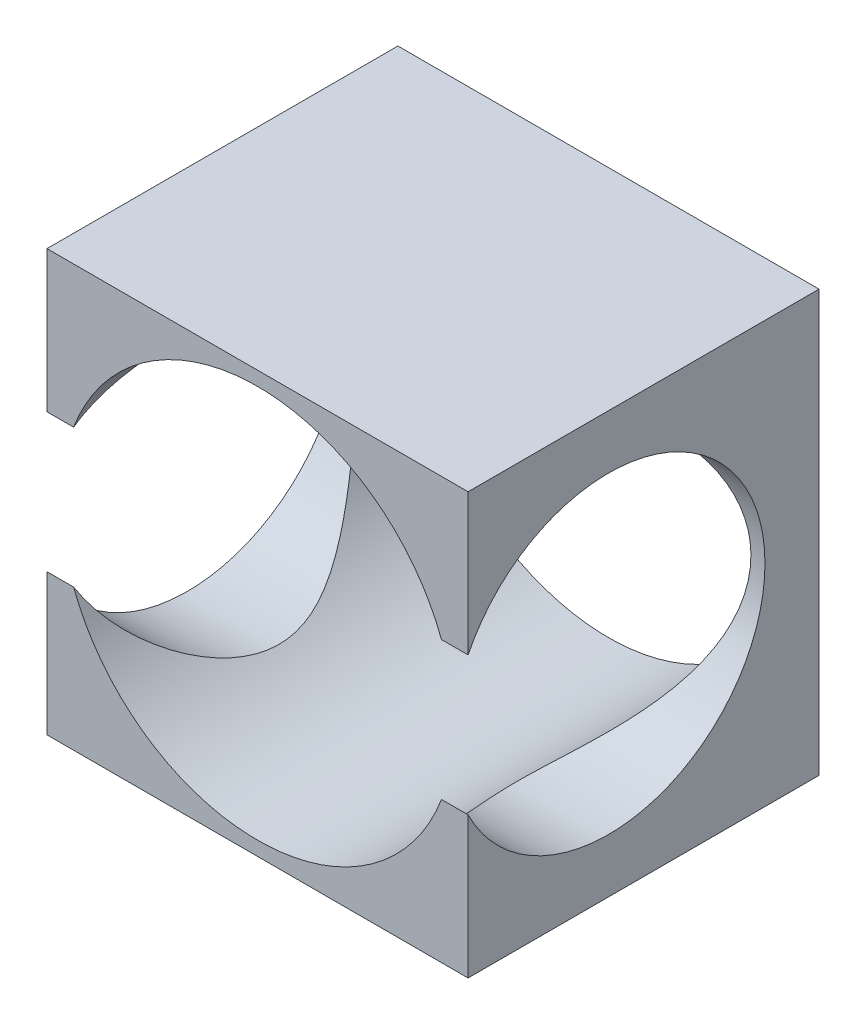
ISO-10303-21;
HEADER;
FILE_DESCRIPTION(('STEP AP214'),'2;1');
FILE_NAME('part.step','',(''),(''),'','','');
FILE_SCHEMA(('AUTOMOTIVE_DESIGN { 1 0 10303 214 1 1 1 1 }'));
ENDSEC;
DATA;
#1=APPLICATION_CONTEXT('core data for automotive mechanical design processes');
#2=APPLICATION_PROTOCOL_DEFINITION('international standard','automotive_design',2000,#1);
#3=PRODUCT_CONTEXT('',#1,'mechanical');
#4=PRODUCT('Part','Part','',(#3));
#5=PRODUCT_RELATED_PRODUCT_CATEGORY('part','',(#4));
#6=PRODUCT_DEFINITION_FORMATION('','',#4);
#7=PRODUCT_DEFINITION_CONTEXT('part definition',#1,'design');
#8=PRODUCT_DEFINITION('design','',#6,#7);
#9=PRODUCT_DEFINITION_SHAPE('','',#8);
#10=(LENGTH_UNIT() NAMED_UNIT(*) SI_UNIT(.MILLI.,.METRE.));
#11=(NAMED_UNIT(*) PLANE_ANGLE_UNIT() SI_UNIT($,.RADIAN.));
#12=(NAMED_UNIT(*) SI_UNIT($,.STERADIAN.) SOLID_ANGLE_UNIT());
#13=UNCERTAINTY_MEASURE_WITH_UNIT(LENGTH_MEASURE(1.E-05),#10,'distance_accuracy_value','');
#14=(GEOMETRIC_REPRESENTATION_CONTEXT(3) GLOBAL_UNCERTAINTY_ASSIGNED_CONTEXT((#13)) GLOBAL_UNIT_ASSIGNED_CONTEXT((#10,
#11,#12)) REPRESENTATION_CONTEXT('',''));
#15=CARTESIAN_POINT('',(0.,0.,0.));
#16=DIRECTION('',(0.,0.,1.));
#17=DIRECTION('',(1.,0.,0.));
#18=AXIS2_PLACEMENT_3D('',#15,#16,#17);
#19=CARTESIAN_POINT('',(0.,0.,25.));
#20=DIRECTION('',(0.,0.,-1.));
#21=DIRECTION('',(-1.,0.,0.));
#22=AXIS2_PLACEMENT_3D('',#19,#20,#21);
#23=PLANE('',#22);
#24=DIRECTION('',(0.,1.,0.));
#25=VECTOR('',#24,1.);
#26=CARTESIAN_POINT('',(15.,15.,25.));
#27=LINE('',#26,#25);
#28=CARTESIAN_POINT('',(15.,-15.,25.));
#29=VERTEX_POINT('',#28);
#30=CARTESIAN_POINT('',(15.,-4.93178466683207,25.));
#31=VERTEX_POINT('',#30);
#32=EDGE_CURVE('E124',#29,#31,#27,.T.);
#33=ORIENTED_EDGE('',*,*,#32,.T.);
#34=DIRECTION('',(-1.,0.,0.));
#35=VECTOR('',#34,1.);
#36=CARTESIAN_POINT('',(15.,-4.93178466683207,25.));
#37=LINE('',#36,#35);
#38=CARTESIAN_POINT('',(13.1025760825877,-4.93178466683207,25.));
#39=VERTEX_POINT('',#38);
#40=EDGE_CURVE('E108',#31,#39,#37,.T.);
#41=ORIENTED_EDGE('',*,*,#40,.T.);
#42=CARTESIAN_POINT('',(0.,0.,25.));
#43=DIRECTION('',(0.,0.,1.));
#44=DIRECTION('',(1.,0.,0.));
#45=AXIS2_PLACEMENT_3D('',#42,#43,#44);
#46=CIRCLE('',#45,14.);
#47=CARTESIAN_POINT('',(-13.1025760825877,-4.93178466683208,25.));
#48=VERTEX_POINT('',#47);
#49=EDGE_CURVE('E263',#48,#39,#46,.T.);
#50=ORIENTED_EDGE('',*,*,#49,.F.);
#51=CARTESIAN_POINT('',(-15.,-4.93178466683208,25.));
#52=VERTEX_POINT('',#51);
#53=EDGE_CURVE('E60',#48,#52,#37,.T.);
#54=ORIENTED_EDGE('',*,*,#53,.T.);
#55=DIRECTION('',(0.,-1.,0.));
#56=VECTOR('',#55,1.);
#57=CARTESIAN_POINT('',(-15.,15.,25.));
#58=LINE('',#57,#56);
#59=CARTESIAN_POINT('',(-15.,-15.,25.));
#60=VERTEX_POINT('',#59);
#61=EDGE_CURVE('E157',#52,#60,#58,.T.);
#62=ORIENTED_EDGE('',*,*,#61,.T.);
#63=DIRECTION('',(1.,0.,0.));
#64=VECTOR('',#63,1.);
#65=CARTESIAN_POINT('',(15.,-15.,25.));
#66=LINE('',#65,#64);
#67=EDGE_CURVE('E131',#60,#29,#66,.T.);
#68=ORIENTED_EDGE('',*,*,#67,.T.);
#69=EDGE_LOOP('',(#33,#41,#50,#54,#62,#68));
#70=FACE_BOUND('',#69,.T.);
#71=ADVANCED_FACE('F39',(#70),#23,.F.);
#72=CARTESIAN_POINT('',(-15.,15.,25.));
#73=VERTEX_POINT('',#72);
#74=CARTESIAN_POINT('',(-15.,4.93178466683207,25.));
#75=VERTEX_POINT('',#74);
#76=EDGE_CURVE('E253',#73,#75,#58,.T.);
#77=ORIENTED_EDGE('',*,*,#76,.T.);
#78=DIRECTION('',(-1.,0.,0.));
#79=VECTOR('',#78,1.);
#80=CARTESIAN_POINT('',(15.,4.93178466683208,25.));
#81=LINE('',#80,#79);
#82=CARTESIAN_POINT('',(-13.1025760825877,4.93178466683207,25.));
#83=VERTEX_POINT('',#82);
#84=EDGE_CURVE('E117',#75,#83,#81,.F.);
#85=ORIENTED_EDGE('',*,*,#84,.T.);
#86=CARTESIAN_POINT('',(13.1025760825877,4.93178466683208,25.));
#87=VERTEX_POINT('',#86);
#88=EDGE_CURVE('E148',#87,#83,#46,.T.);
#89=ORIENTED_EDGE('',*,*,#88,.F.);
#90=CARTESIAN_POINT('',(15.,4.93178466683208,25.));
#91=VERTEX_POINT('',#90);
#92=EDGE_CURVE('E68',#87,#91,#81,.F.);
#93=ORIENTED_EDGE('',*,*,#92,.T.);
#94=CARTESIAN_POINT('',(15.,15.,25.));
#95=VERTEX_POINT('',#94);
#96=EDGE_CURVE('E126',#91,#95,#27,.T.);
#97=ORIENTED_EDGE('',*,*,#96,.T.);
#98=DIRECTION('',(-1.,0.,0.));
#99=VECTOR('',#98,1.);
#100=CARTESIAN_POINT('',(15.,15.,25.));
#101=LINE('',#100,#99);
#102=EDGE_CURVE('E134',#95,#73,#101,.T.);
#103=ORIENTED_EDGE('',*,*,#102,.T.);
#104=EDGE_LOOP('',(#77,#85,#89,#93,#97,#103));
#105=FACE_BOUND('',#104,.T.);
#106=ADVANCED_FACE('F219',(#105),#23,.F.);
#107=CARTESIAN_POINT('',(0.,0.,0.));
#108=DIRECTION('',(0.,0.,-1.));
#109=DIRECTION('',(-1.,0.,0.));
#110=AXIS2_PLACEMENT_3D('',#107,#108,#109);
#111=PLANE('',#110);
#112=CARTESIAN_POINT('',(12.,11.9999999999993,0.));
#113=DIRECTION('',(0.,0.,-1.));
#114=DIRECTION('',(-1.,0.,0.));
#115=AXIS2_PLACEMENT_3D('',#112,#113,#114);
#116=CIRCLE('',#115,1.36336852858037);
#117=CARTESIAN_POINT('',(10.6366314714196,11.9999999999993,0.));
#118=VERTEX_POINT('',#117);
#119=EDGE_CURVE('E280',#118,#118,#116,.T.);
#120=ORIENTED_EDGE('',*,*,#119,.F.);
#121=EDGE_LOOP('',(#120));
#122=FACE_BOUND('',#121,.T.);
#123=CARTESIAN_POINT('',(11.9999999999993,-12.0000000000007,0.));
#124=DIRECTION('',(0.,0.,-1.));
#125=DIRECTION('',(-1.,0.,0.));
#126=AXIS2_PLACEMENT_3D('',#123,#124,#125);
#127=CIRCLE('',#126,1.36336852858015);
#128=CARTESIAN_POINT('',(10.6366314714192,-12.0000000000007,0.));
#129=VERTEX_POINT('',#128);
#130=EDGE_CURVE('E288',#129,#129,#127,.T.);
#131=ORIENTED_EDGE('',*,*,#130,.F.);
#132=EDGE_LOOP('',(#131));
#133=FACE_BOUND('',#132,.T.);
#134=CARTESIAN_POINT('',(-12.0000000000007,-12.,0.));
#135=DIRECTION('',(0.,0.,-1.));
#136=DIRECTION('',(-1.,0.,0.));
#137=AXIS2_PLACEMENT_3D('',#134,#135,#136);
#138=CIRCLE('',#137,1.36336852857949);
#139=CARTESIAN_POINT('',(-13.3633685285801,-12.,0.));
#140=VERTEX_POINT('',#139);
#141=EDGE_CURVE('E296',#140,#140,#138,.T.);
#142=ORIENTED_EDGE('',*,*,#141,.F.);
#143=EDGE_LOOP('',(#142));
#144=FACE_BOUND('',#143,.T.);
#145=CARTESIAN_POINT('',(-12.,12.,0.));
#146=DIRECTION('',(0.,0.,-1.));
#147=DIRECTION('',(-1.,0.,0.));
#148=AXIS2_PLACEMENT_3D('',#145,#146,#147);
#149=CIRCLE('',#148,1.36336852857966);
#150=CARTESIAN_POINT('',(-13.3633685285797,12.,0.));
#151=VERTEX_POINT('',#150);
#152=EDGE_CURVE('E272',#151,#151,#149,.T.);
#153=ORIENTED_EDGE('',*,*,#152,.F.);
#154=EDGE_LOOP('',(#153));
#155=FACE_BOUND('',#154,.T.);
#156=DIRECTION('',(0.,-1.,0.));
#157=VECTOR('',#156,1.);
#158=CARTESIAN_POINT('',(-15.,15.,0.));
#159=LINE('',#158,#157);
#160=CARTESIAN_POINT('',(-15.,15.,0.));
#161=VERTEX_POINT('',#160);
#162=CARTESIAN_POINT('',(-15.,-15.,0.));
#163=VERTEX_POINT('',#162);
#164=EDGE_CURVE('E143',#161,#163,#159,.T.);
#165=ORIENTED_EDGE('',*,*,#164,.F.);
#166=DIRECTION('',(-1.,0.,0.));
#167=VECTOR('',#166,1.);
#168=CARTESIAN_POINT('',(15.,15.,0.));
#169=LINE('',#168,#167);
#170=CARTESIAN_POINT('',(15.,15.,0.));
#171=VERTEX_POINT('',#170);
#172=EDGE_CURVE('E154',#171,#161,#169,.T.);
#173=ORIENTED_EDGE('',*,*,#172,.F.);
#174=DIRECTION('',(0.,1.,0.));
#175=VECTOR('',#174,1.);
#176=CARTESIAN_POINT('',(15.,15.,0.));
#177=LINE('',#176,#175);
#178=CARTESIAN_POINT('',(15.,-15.,0.));
#179=VERTEX_POINT('',#178);
#180=EDGE_CURVE('E151',#179,#171,#177,.T.);
#181=ORIENTED_EDGE('',*,*,#180,.F.);
#182=DIRECTION('',(1.,0.,0.));
#183=VECTOR('',#182,1.);
#184=CARTESIAN_POINT('',(15.,-15.,0.));
#185=LINE('',#184,#183);
#186=EDGE_CURVE('E147',#163,#179,#185,.T.);
#187=ORIENTED_EDGE('',*,*,#186,.F.);
#188=EDGE_LOOP('',(#165,#173,#181,#187));
#189=FACE_BOUND('',#188,.T.);
#190=CARTESIAN_POINT('',(0.,0.,0.));
#191=DIRECTION('',(0.,0.,1.));
#192=DIRECTION('',(1.,0.,0.));
#193=AXIS2_PLACEMENT_3D('',#190,#191,#192);
#194=CIRCLE('',#193,14.);
#195=CARTESIAN_POINT('',(14.,0.,0.));
#196=VERTEX_POINT('',#195);
#197=EDGE_CURVE('E259',#196,#196,#194,.T.);
#198=ORIENTED_EDGE('',*,*,#197,.T.);
#199=EDGE_LOOP('',(#198));
#200=FACE_BOUND('',#199,.T.);
#201=ADVANCED_FACE('F223',(#122,#133,#144,#155,#189,#200),#111,.T.);
#202=CARTESIAN_POINT('',(-15.,15.,25.));
#203=DIRECTION('',(1.,0.,0.));
#204=DIRECTION('',(0.,1.,0.));
#205=AXIS2_PLACEMENT_3D('',#202,#203,#204);
#206=PLANE('',#205);
#207=ORIENTED_EDGE('',*,*,#61,.F.);
#208=CARTESIAN_POINT('',(-15.,0.,15.));
#209=DIRECTION('',(-1.,0.,0.));
#210=DIRECTION('',(0.,-1.,0.));
#211=AXIS2_PLACEMENT_3D('',#208,#209,#210);
#212=CIRCLE('',#211,11.15);
#213=EDGE_CURVE('E128',#75,#52,#212,.T.);
#214=ORIENTED_EDGE('',*,*,#213,.F.);
#215=ORIENTED_EDGE('',*,*,#76,.F.);
#216=DIRECTION('',(0.,0.,-1.));
#217=VECTOR('',#216,1.);
#218=CARTESIAN_POINT('',(-15.,15.,25.));
#219=LINE('',#218,#217);
#220=EDGE_CURVE('E138',#73,#161,#219,.T.);
#221=ORIENTED_EDGE('',*,*,#220,.T.);
#222=ORIENTED_EDGE('',*,*,#164,.T.);
#223=DIRECTION('',(0.,0.,-1.));
#224=VECTOR('',#223,1.);
#225=CARTESIAN_POINT('',(-15.,-15.,25.));
#226=LINE('',#225,#224);
#227=EDGE_CURVE('E168',#60,#163,#226,.T.);
#228=ORIENTED_EDGE('',*,*,#227,.F.);
#229=EDGE_LOOP('',(#207,#214,#215,#221,#222,#228));
#230=FACE_BOUND('',#229,.T.);
#231=ADVANCED_FACE('F41',(#230),#206,.F.);
#232=CARTESIAN_POINT('',(15.,-15.,25.));
#233=DIRECTION('',(0.,1.,0.));
#234=DIRECTION('',(-1.,0.,0.));
#235=AXIS2_PLACEMENT_3D('',#232,#233,#234);
#236=PLANE('',#235);
#237=ORIENTED_EDGE('',*,*,#186,.T.);
#238=DIRECTION('',(0.,0.,-1.));
#239=VECTOR('',#238,1.);
#240=CARTESIAN_POINT('',(15.,-15.,25.));
#241=LINE('',#240,#239);
#242=EDGE_CURVE('E165',#29,#179,#241,.T.);
#243=ORIENTED_EDGE('',*,*,#242,.F.);
#244=ORIENTED_EDGE('',*,*,#67,.F.);
#245=ORIENTED_EDGE('',*,*,#227,.T.);
#246=EDGE_LOOP('',(#237,#243,#244,#245));
#247=FACE_BOUND('',#246,.T.);
#248=ADVANCED_FACE('F234',(#247),#236,.F.);
#249=CARTESIAN_POINT('',(15.,15.,25.));
#250=DIRECTION('',(-1.,0.,0.));
#251=DIRECTION('',(0.,-1.,0.));
#252=AXIS2_PLACEMENT_3D('',#249,#250,#251);
#253=PLANE('',#252);
#254=ORIENTED_EDGE('',*,*,#96,.F.);
#255=CARTESIAN_POINT('',(15.,0.,15.));
#256=DIRECTION('',(-1.,0.,0.));
#257=DIRECTION('',(0.,-1.,0.));
#258=AXIS2_PLACEMENT_3D('',#255,#256,#257);
#259=CIRCLE('',#258,11.15);
#260=EDGE_CURVE('E111',#91,#31,#259,.T.);
#261=ORIENTED_EDGE('',*,*,#260,.T.);
#262=ORIENTED_EDGE('',*,*,#32,.F.);
#263=ORIENTED_EDGE('',*,*,#242,.T.);
#264=ORIENTED_EDGE('',*,*,#180,.T.);
#265=DIRECTION('',(0.,0.,-1.));
#266=VECTOR('',#265,1.);
#267=CARTESIAN_POINT('',(15.,15.,25.));
#268=LINE('',#267,#266);
#269=EDGE_CURVE('E161',#95,#171,#268,.T.);
#270=ORIENTED_EDGE('',*,*,#269,.F.);
#271=EDGE_LOOP('',(#254,#261,#262,#263,#264,#270));
#272=FACE_BOUND('',#271,.T.);
#273=ADVANCED_FACE('F122',(#272),#253,.F.);
#274=CARTESIAN_POINT('',(15.,15.,25.));
#275=DIRECTION('',(0.,-1.,0.));
#276=DIRECTION('',(1.,0.,0.));
#277=AXIS2_PLACEMENT_3D('',#274,#275,#276);
#278=PLANE('',#277);
#279=ORIENTED_EDGE('',*,*,#172,.T.);
#280=ORIENTED_EDGE('',*,*,#220,.F.);
#281=ORIENTED_EDGE('',*,*,#102,.F.);
#282=ORIENTED_EDGE('',*,*,#269,.T.);
#283=EDGE_LOOP('',(#279,#280,#281,#282));
#284=FACE_BOUND('',#283,.T.);
#285=ADVANCED_FACE('F229',(#284),#278,.F.);
#286=CARTESIAN_POINT('',(0.,0.,25.));
#287=DIRECTION('',(0.,0.,-1.));
#288=DIRECTION('',(-1.,0.,0.));
#289=AXIS2_PLACEMENT_3D('',#286,#287,#288);
#290=CYLINDRICAL_SURFACE('',#289,14.);
#291=CARTESIAN_POINT('',(-13.1025760825877,-4.93178466683208,25.));
#292=CARTESIAN_POINT('',(-12.9887783529517,-5.23421419488892,24.8508376342914));
#293=CARTESIAN_POINT('',(-12.8665483815956,-5.52710747355063,24.6893468760296));
#294=CARTESIAN_POINT('',(-12.6085752131752,-6.09262052423046,24.3440953083494));
#295=CARTESIAN_POINT('',(-12.4728490390368,-6.36526509621003,24.1603624910479));
#296=CARTESIAN_POINT('',(-12.1911586341299,-6.88942182592347,23.7729382298264));
#297=CARTESIAN_POINT('',(-12.0452109649413,-7.14096678083283,23.5692788689796));
#298=CARTESIAN_POINT('',(-11.7459811365691,-7.62315115394514,23.1433158317503));
#299=CARTESIAN_POINT('',(-11.5926966700582,-7.85378392865791,22.9210062733576));
#300=CARTESIAN_POINT('',(-11.2828101891928,-8.29276950110354,22.4601124961406));
#301=CARTESIAN_POINT('',(-11.1262281190263,-8.50122596580811,22.2216133908344));
#302=CARTESIAN_POINT('',(-10.8123907581524,-8.89696364600976,21.7280460398588));
#303=CARTESIAN_POINT('',(-10.6551354415557,-9.08424403946544,21.4729771515659));
#304=CARTESIAN_POINT('',(-10.3436915762659,-9.4373450899898,20.9463922432151));
#305=CARTESIAN_POINT('',(-10.1895045579359,-9.60315525476708,20.6748682761568));
#306=CARTESIAN_POINT('',(-9.88883367959778,-9.91248805338215,20.1153896590899));
#307=CARTESIAN_POINT('',(-9.74234702307798,-10.0560188158495,19.8274410542854));
#308=CARTESIAN_POINT('',(-9.50790990391392,-10.2769941458775,19.3305932828693));
#309=CARTESIAN_POINT('',(-9.41634031055152,-10.3608062560434,19.1262181034476));
#310=CARTESIAN_POINT('',(-9.24140642669867,-10.5171363315957,18.7096936691483));
#311=CARTESIAN_POINT('',(-9.15804310167615,-10.5896529686522,18.4975435035627));
#312=CARTESIAN_POINT('',(-9.00213011883525,-10.7225057350015,18.0661362320965));
#313=CARTESIAN_POINT('',(-8.92955649904224,-10.7828689637938,17.8468962319737));
#314=CARTESIAN_POINT('',(-8.79767020469302,-10.8907424886888,17.4013955512337));
#315=CARTESIAN_POINT('',(-8.7383524053564,-10.9382577533892,17.1751376224503));
#316=CARTESIAN_POINT('',(-8.64457892338949,-11.012455838992,16.7565047881617));
#317=CARTESIAN_POINT('',(-8.60759309422161,-11.0413249776939,16.5650848886693));
#318=CARTESIAN_POINT('',(-8.54585249359701,-11.0891812183278,16.1791263884067));
#319=CARTESIAN_POINT('',(-8.52109177293486,-11.1081731271385,15.9845893522366));
#320=CARTESIAN_POINT('',(-8.48481623568604,-11.1359068222375,15.5936714717287));
#321=CARTESIAN_POINT('',(-8.47329280069976,-11.1446552778026,15.3972919110771));
#322=CARTESIAN_POINT('',(-8.46397511982196,-11.1517335649993,15.0040116779049));
#323=CARTESIAN_POINT('',(-8.46618106628972,-11.1500632506558,14.8071109981217));
#324=CARTESIAN_POINT('',(-8.48421552493971,-11.1363464064946,14.4144645598795));
#325=CARTESIAN_POINT('',(-8.50003318335374,-11.1243081439117,14.2187180063187));
#326=CARTESIAN_POINT('',(-8.54458509730658,-11.0901238246574,13.8296128838672));
#327=CARTESIAN_POINT('',(-8.57331945819693,-11.0679776855438,13.6362543344669));
#328=CARTESIAN_POINT('',(-8.64260096631545,-11.0139625352675,13.2528107317564));
#329=CARTESIAN_POINT('',(-8.68316307064017,-10.9820812107859,13.0627301480403));
#330=CARTESIAN_POINT('',(-8.7746698728894,-10.9091058041691,12.6868662134602));
#331=CARTESIAN_POINT('',(-8.82561773093081,-10.8680089175946,12.5010841897411));
#332=CARTESIAN_POINT('',(-8.96339277406247,-10.7549490886205,12.0449109686328));
#333=CARTESIAN_POINT('',(-9.05560068232055,-10.6777074585978,11.7774416501676));
#334=CARTESIAN_POINT('',(-9.25481538569384,-10.5055090915351,11.2539618860941));
#335=CARTESIAN_POINT('',(-9.36182959272556,-10.4105434736462,10.9979572651174));
#336=CARTESIAN_POINT('',(-9.58673223394592,-10.2038205683363,10.4968680946616));
#337=CARTESIAN_POINT('',(-9.70464984716077,-10.0920176888186,10.2518156123556));
#338=CARTESIAN_POINT('',(-9.94755510736531,-9.85267685486661,9.77325784345241));
#339=CARTESIAN_POINT('',(-10.0725423987605,-9.72513969146333,9.53975197718269));
#340=CARTESIAN_POINT('',(-10.3663770817765,-9.41262150102573,9.01284796500428));
#341=CARTESIAN_POINT('',(-10.5367262592172,-9.22214322625381,8.72353353679664));
#342=CARTESIAN_POINT('',(-10.8790927992864,-8.81566967195463,8.16436114551135));
#343=CARTESIAN_POINT('',(-11.0511106807575,-8.59966620629997,7.89450946921473));
#344=CARTESIAN_POINT('',(-11.3919484625575,-8.14276779698837,7.37521884859543));
#345=CARTESIAN_POINT('',(-11.5607717394422,-7.90190109836265,7.1257573058782));
#346=CARTESIAN_POINT('',(-11.8911738795332,-7.39536162115058,6.64822182226211));
#347=CARTESIAN_POINT('',(-12.0527551906455,-7.12969731961019,6.42014062555605));
#348=CARTESIAN_POINT('',(-12.3318235707118,-6.63245372193324,6.0328168523127));
#349=CARTESIAN_POINT('',(-12.451433041623,-6.40547029905498,5.86918977180891));
#350=CARTESIAN_POINT('',(-12.6816533407883,-5.93665143531961,5.55765672360376));
#351=CARTESIAN_POINT('',(-12.7922659568958,-5.69481896210805,5.40974763062727));
#352=CARTESIAN_POINT('',(-13.0023965328125,-5.19716832794095,5.13120272714219));
#353=CARTESIAN_POINT('',(-13.1019264962962,-4.94136575476293,5.00054819901947));
#354=CARTESIAN_POINT('',(-13.2880340566548,-4.41651766120062,4.75790991341728));
#355=CARTESIAN_POINT('',(-13.3746135872451,-4.14747412590197,4.64592336821032));
#356=CARTESIAN_POINT('',(-13.52092994083,-3.63915552224572,4.45765689191971));
#357=CARTESIAN_POINT('',(-13.5827460176764,-3.40152779626527,4.37853837998416));
#358=CARTESIAN_POINT('',(-13.694565454543,-2.91893728613214,4.23591226650879));
#359=CARTESIAN_POINT('',(-13.7445709469678,-2.67397583509884,4.17240184683888));
#360=CARTESIAN_POINT('',(-13.8318035476458,-2.17819582050779,4.06188129692984));
#361=CARTESIAN_POINT('',(-13.8690348248015,-1.92737919639779,4.01486578341663));
#362=CARTESIAN_POINT('',(-13.9299776121543,-1.42148740738285,3.93802346551209));
#363=CARTESIAN_POINT('',(-13.9536889588702,-1.16641219102195,3.90819686896689));
#364=CARTESIAN_POINT('',(-13.9871273262331,-0.653144308339897,3.8661599528713));
#365=CARTESIAN_POINT('',(-13.9968134359403,-0.394944728419742,3.85400116911558));
#366=CARTESIAN_POINT('',(-14.0018544060871,0.121816421907694,3.84767151854596));
#367=CARTESIAN_POINT('',(-13.9972092401944,0.380377992979229,3.85350068478327));
#368=CARTESIAN_POINT('',(-13.9736909860817,0.895843205199144,3.88304811235112));
#369=CARTESIAN_POINT('',(-13.9548165985034,1.15274669277675,3.90676800739504));
#370=CARTESIAN_POINT('',(-13.9032529868709,1.66291645761688,3.97170308921471));
#371=CARTESIAN_POINT('',(-13.8705639556673,1.91618278560263,4.01291803176199));
#372=CARTESIAN_POINT('',(-13.7937897931493,2.40627652155016,4.11000560145911));
#373=CARTESIAN_POINT('',(-13.7502689443046,2.64333709514117,4.16515405165877));
#374=CARTESIAN_POINT('',(-13.6520060967279,3.11125434001027,4.29013250340905));
#375=CARTESIAN_POINT('',(-13.5972602215315,3.34210883683804,4.3599675770709));
#376=CARTESIAN_POINT('',(-13.4774931979169,3.79635929554347,4.5134550207985));
#377=CARTESIAN_POINT('',(-13.4124743244174,4.01975689548896,4.59710433193574));
#378=CARTESIAN_POINT('',(-13.2731378714007,4.45833851261599,4.77737995898847));
#379=CARTESIAN_POINT('',(-13.1988169090439,4.67351950436476,4.87401099684001));
#380=CARTESIAN_POINT('',(-13.0335777820955,5.11739683682902,5.09030628525269));
#381=CARTESIAN_POINT('',(-12.9417348701465,5.34508712080207,5.21132792145168));
#382=CARTESIAN_POINT('',(-12.7493912521699,5.78891658803717,5.46707893940776));
#383=CARTESIAN_POINT('',(-12.6488869550832,6.00505091937214,5.60181401106451));
#384=CARTESIAN_POINT('',(-12.4406763077636,6.42530769541241,5.88397024226262));
#385=CARTESIAN_POINT('',(-12.3329679880401,6.62942682639925,6.03139487415933));
#386=CARTESIAN_POINT('',(-12.1118109959154,7.02534451657401,6.33802885691184));
#387=CARTESIAN_POINT('',(-11.9983615620828,7.21714143379706,6.49723977225996));
#388=CARTESIAN_POINT('',(-11.7429398155155,7.62714032608053,6.8612456706812));
#389=CARTESIAN_POINT('',(-11.5999721832833,7.8424535932573,7.06860170939642));
#390=CARTESIAN_POINT('',(-11.3103549180673,8.25465521903203,7.49854087874509));
#391=CARTESIAN_POINT('',(-11.1637046220818,8.45154022933114,7.72112676387793));
#392=CARTESIAN_POINT('',(-10.8693693552137,8.82687552975064,8.18113054616772));
#393=CARTESIAN_POINT('',(-10.7216835246227,9.00530790177482,8.41856250702284));
#394=CARTESIAN_POINT('',(-10.4285221546076,9.34322881784751,8.90779554394506));
#395=CARTESIAN_POINT('',(-10.2830462553644,9.50272047527178,9.1595942483802));
#396=CARTESIAN_POINT('',(-10.0195422798362,9.77954797312595,9.63834401652563));
#397=CARTESIAN_POINT('',(-9.90069760178503,9.89960870648624,9.86327166747449));
#398=CARTESIAN_POINT('',(-9.66981988476173,10.1252469814304,10.3237188715833));
#399=CARTESIAN_POINT('',(-9.55778730838742,10.2308235400297,10.5592391421842));
#400=CARTESIAN_POINT('',(-9.34389254250157,10.4265358960743,11.0405524481337));
#401=CARTESIAN_POINT('',(-9.24201272843079,10.516698652766,11.2863265924139));
#402=CARTESIAN_POINT('',(-9.05195940879602,10.6807206108743,11.788399650489));
#403=CARTESIAN_POINT('',(-8.96378054812803,10.7545861869118,12.0446944024701));
#404=CARTESIAN_POINT('',(-8.82690143638443,10.8669863961809,12.4960976028834));
#405=CARTESIAN_POINT('',(-8.77398553479752,10.9096669137077,12.6888989472193));
#406=CARTESIAN_POINT('',(-8.679370506757,10.9850896023486,13.0791231325098));
#407=CARTESIAN_POINT('',(-8.63766792110378,11.017834838802,13.2765445277469));
#408=CARTESIAN_POINT('',(-8.56710643795466,11.0727907571872,13.6748064410875));
#409=CARTESIAN_POINT('',(-8.53822675539271,11.0950184911553,13.8756408740689));
#410=CARTESIAN_POINT('',(-8.49446455323188,11.1285596818921,14.279752613114));
#411=CARTESIAN_POINT('',(-8.47958179313935,11.1398733261857,14.4830298771445));
#412=CARTESIAN_POINT('',(-8.46448449468606,11.1513495580557,14.891363925736));
#413=CARTESIAN_POINT('',(-8.46433589862117,11.1514620150747,15.0964246028865));
#414=CARTESIAN_POINT('',(-8.4788797785622,11.1404074124485,15.50570281408));
#415=CARTESIAN_POINT('',(-8.4935721646507,11.1292404211424,15.7099203532239));
#416=CARTESIAN_POINT('',(-8.53711653258083,11.0958724578123,16.1161019811138));
#417=CARTESIAN_POINT('',(-8.56598169262722,11.0736612163197,16.3180637933324));
#418=CARTESIAN_POINT('',(-8.63662675293335,11.0186510822136,16.7183382464506));
#419=CARTESIAN_POINT('',(-8.67841462065703,10.9858456572279,16.9166485558823));
#420=CARTESIAN_POINT('',(-8.78741589108456,10.8989684317119,17.366857811539));
#421=CARTESIAN_POINT('',(-8.85849477850337,10.8414737521175,17.61716170932));
#422=CARTESIAN_POINT('',(-9.01595715108628,10.7108803699506,18.1087471157502));
#423=CARTESIAN_POINT('',(-9.10234861237807,10.6377735311152,18.3500238425489));
#424=CARTESIAN_POINT('',(-9.28712806893084,10.4768457517138,18.8237375920025));
#425=CARTESIAN_POINT('',(-9.38555123519657,10.3889813778876,19.0561459608629));
#426=CARTESIAN_POINT('',(-9.59104457331349,10.1995788323402,19.5113033953527));
#427=CARTESIAN_POINT('',(-9.69811494450397,10.0980403453611,19.7340522381242));
#428=CARTESIAN_POINT('',(-9.9654323813471,9.83558020660642,20.2635316978736));
#429=CARTESIAN_POINT('',(-10.1288006758703,9.66786055665675,20.5653337029911));
#430=CARTESIAN_POINT('',(-10.4614264890155,9.30692654254916,21.1499321745148));
#431=CARTESIAN_POINT('',(-10.6306864355842,9.11370157384361,21.4327206612962));
#432=CARTESIAN_POINT('',(-10.9696203669718,8.70277243810358,21.9785900234104));
#433=CARTESIAN_POINT('',(-11.1392929403637,8.48511580578361,22.2417075636988));
#434=CARTESIAN_POINT('',(-11.4749548541762,8.02535955698895,22.7480957481096));
#435=CARTESIAN_POINT('',(-11.6409453114977,7.78326747971934,22.991372472201));
#436=CARTESIAN_POINT('',(-11.9241893640303,7.33923998081977,23.3978737267206));
#437=CARTESIAN_POINT('',(-12.0431445229346,7.14265028936453,23.5657747031112));
#438=CARTESIAN_POINT('',(-12.2751307937806,6.73616398379327,23.8889815077805));
#439=CARTESIAN_POINT('',(-12.3881638662059,6.52627182490484,24.0442915136898));
#440=CARTESIAN_POINT('',(-12.6068825153121,6.09306478207169,24.3416363581353));
#441=CARTESIAN_POINT('',(-12.7125569017782,5.86973037840175,24.4836510870618));
#442=CARTESIAN_POINT('',(-12.9148230086779,5.41022525941572,24.7531002205316));
#443=CARTESIAN_POINT('',(-13.0114067501705,5.17404354953114,24.8805218374435));
#444=CARTESIAN_POINT('',(-13.1025760825877,4.93178466683207,25.));
#445=B_SPLINE_CURVE_WITH_KNOTS('',3,(#291,#292,#293,#294,#295,#296,#297,#298,#299,#300,#301,
#302,#303,#304,#305,#306,#307,#308,#309,#310,#311,#312,#313,#314,#315,#316,#317,#318,#319,#320,
#321,#322,#323,#324,#325,#326,#327,#328,#329,#330,#331,#332,#333,#334,#335,#336,#337,#338,#339,
#340,#341,#342,#343,#344,#345,#346,#347,#348,#349,#350,#351,#352,#353,#354,#355,#356,#357,#358,
#359,#360,#361,#362,#363,#364,#365,#366,#367,#368,#369,#370,#371,#372,#373,#374,#375,#376,#377,
#378,#379,#380,#381,#382,#383,#384,#385,#386,#387,#388,#389,#390,#391,#392,#393,#394,#395,#396,
#397,#398,#399,#400,#401,#402,#403,#404,#405,#406,#407,#408,#409,#410,#411,#412,#413,#414,#415,
#416,#417,#418,#419,#420,#421,#422,#423,#424,#425,#426,#427,#428,#429,#430,#431,#432,#433,#434,
#435,#436,#437,#438,#439,#440,#441,#442,#443,#444),.UNSPECIFIED.,.F.,.F.,(4,2,2,2,2,2,2,2,2,2,2,
2,2,2,2,2,2,2,2,2,2,2,2,2,2,2,2,2,2,2,2,2,2,2,2,2,2,2,2,2,2,2,2,2,2,2,2,2,2,2,2,2,2,2,2,2,2,2,2,
2,2,2,2,2,2,2,2,2,2,2,2,2,2,2,2,2,4),(0.,1.06690648275029,2.13248393337313,3.19637311439611,
4.26059910169897,5.31960864985628,6.37865929397556,7.43822554810586,8.49740430669548,
9.2143142535514,9.93130844434986,10.6466857404558,11.3617859870545,11.9524513457714,
12.5428289801202,13.1328220190563,13.722823324271,14.3123546070578,14.9018906982815,
15.4921755607788,16.082640300541,16.9610580609267,17.8399171521076,18.7212003005842,
19.6024391611569,20.7590318563619,21.9159964917008,23.0716609670314,24.2269318159803,
25.1390312959928,26.0509490786651,26.9618693488538,27.872653467389,28.6457691966284,
29.418745232687,30.1914687652695,30.9642016413275,31.7391840324454,32.5141678475233,
33.2892224397478,34.0642662126724,34.8052315143991,35.5464531342878,36.2875108427595,
37.028838834961,37.8492283639785,38.6699596827597,39.490916303777,40.3119820933273,
41.3051000055315,42.2983980121809,43.2926516607051,44.2867416521322,45.1300632194641,
45.9734419914675,46.8153302298453,47.6568885786232,48.2696714687772,48.8822651038852,
49.4938621080781,50.1054486036836,50.7197721127729,51.3340918998681,51.9489839819107,
52.5642559325643,53.3624371319774,54.1610353223887,54.9620264497116,55.7630360471184,
56.9073934950917,58.0522282491816,59.1948729848679,60.3371662454062,61.1903304461114,
62.0432104020188,62.8973602058071,63.7522528467654),.UNSPECIFIED.);
#446=EDGE_CURVE('E11',#48,#83,#445,.T.);
#447=ORIENTED_EDGE('',*,*,#446,.F.);
#448=ORIENTED_EDGE('',*,*,#49,.T.);
#449=CARTESIAN_POINT('',(13.1025760825877,4.93178466683208,25.));
#450=CARTESIAN_POINT('',(12.9887783529517,5.23421419488892,24.8508376342914));
#451=CARTESIAN_POINT('',(12.8665483815956,5.52710747355063,24.6893468760296));
#452=CARTESIAN_POINT('',(12.6085752131752,6.09262052423046,24.3440953083494));
#453=CARTESIAN_POINT('',(12.4728490390368,6.36526509621003,24.1603624910479));
#454=CARTESIAN_POINT('',(12.1911586341299,6.88942182592347,23.7729382298264));
#455=CARTESIAN_POINT('',(12.0452109649413,7.14096678083283,23.5692788689796));
#456=CARTESIAN_POINT('',(11.7459811365691,7.62315115394514,23.1433158317503));
#457=CARTESIAN_POINT('',(11.5926966700582,7.85378392865791,22.9210062733576));
#458=CARTESIAN_POINT('',(11.2828101891928,8.29276950110354,22.4601124961406));
#459=CARTESIAN_POINT('',(11.1262281190263,8.50122596580811,22.2216133908344));
#460=CARTESIAN_POINT('',(10.8123907581524,8.89696364600976,21.7280460398588));
#461=CARTESIAN_POINT('',(10.6551354415557,9.08424403946545,21.4729771515659));
#462=CARTESIAN_POINT('',(10.3436915762659,9.4373450899898,20.9463922432151));
#463=CARTESIAN_POINT('',(10.1895045579359,9.60315525476708,20.6748682761568));
#464=CARTESIAN_POINT('',(9.88883367959778,9.91248805338214,20.1153896590899));
#465=CARTESIAN_POINT('',(9.74234702307798,10.0560188158495,19.8274410542854));
#466=CARTESIAN_POINT('',(9.50790990391392,10.2769941458775,19.3305932828693));
#467=CARTESIAN_POINT('',(9.41634031055152,10.3608062560434,19.1262181034476));
#468=CARTESIAN_POINT('',(9.24140642669867,10.5171363315957,18.7096936691483));
#469=CARTESIAN_POINT('',(9.15804310167615,10.5896529686522,18.4975435035627));
#470=CARTESIAN_POINT('',(9.00213011883525,10.7225057350015,18.0661362320965));
#471=CARTESIAN_POINT('',(8.92955649904224,10.7828689637938,17.8468962319737));
#472=CARTESIAN_POINT('',(8.79767020469302,10.8907424886888,17.4013955512337));
#473=CARTESIAN_POINT('',(8.7383524053564,10.9382577533892,17.1751376224503));
#474=CARTESIAN_POINT('',(8.64457892338949,11.012455838992,16.7565047881617));
#475=CARTESIAN_POINT('',(8.60759309422161,11.0413249776939,16.5650848886693));
#476=CARTESIAN_POINT('',(8.54585249359701,11.0891812183278,16.1791263884067));
#477=CARTESIAN_POINT('',(8.52109177293486,11.1081731271385,15.9845893522366));
#478=CARTESIAN_POINT('',(8.48481623568604,11.1359068222375,15.5936714717287));
#479=CARTESIAN_POINT('',(8.47329280069976,11.1446552778026,15.3972919110771));
#480=CARTESIAN_POINT('',(8.46397511982196,11.1517335649993,15.0040116779049));
#481=CARTESIAN_POINT('',(8.46618106628972,11.1500632506558,14.8071109981217));
#482=CARTESIAN_POINT('',(8.48421552493971,11.1363464064946,14.4144645598795));
#483=CARTESIAN_POINT('',(8.50003318335374,11.1243081439117,14.2187180063187));
#484=CARTESIAN_POINT('',(8.54458509730658,11.0901238246574,13.8296128838672));
#485=CARTESIAN_POINT('',(8.57331945819693,11.0679776855438,13.6362543344669));
#486=CARTESIAN_POINT('',(8.64260096631545,11.0139625352675,13.2528107317564));
#487=CARTESIAN_POINT('',(8.68316307064017,10.9820812107859,13.0627301480402));
#488=CARTESIAN_POINT('',(8.7746698728894,10.9091058041691,12.6868662134601));
#489=CARTESIAN_POINT('',(8.82561773093081,10.8680089175946,12.5010841897411));
#490=CARTESIAN_POINT('',(8.96339277406247,10.7549490886205,12.0449109686328));
#491=CARTESIAN_POINT('',(9.05560068232055,10.6777074585978,11.7774416501676));
#492=CARTESIAN_POINT('',(9.25481538569384,10.5055090915351,11.2539618860941));
#493=CARTESIAN_POINT('',(9.36182959272556,10.4105434736462,10.9979572651174));
#494=CARTESIAN_POINT('',(9.58673223394593,10.2038205683363,10.4968680946616));
#495=CARTESIAN_POINT('',(9.70464984716077,10.0920176888186,10.2518156123556));
#496=CARTESIAN_POINT('',(9.94755510736531,9.85267685486662,9.77325784345241));
#497=CARTESIAN_POINT('',(10.0725423987605,9.72513969146333,9.53975197718268));
#498=CARTESIAN_POINT('',(10.3663770817765,9.41262150102572,9.01284796500428));
#499=CARTESIAN_POINT('',(10.5367262592172,9.2221432262538,8.72353353679663));
#500=CARTESIAN_POINT('',(10.8790927992864,8.81566967195463,8.16436114551135));
#501=CARTESIAN_POINT('',(11.0511106807575,8.59966620629997,7.89450946921473));
#502=CARTESIAN_POINT('',(11.3919484625575,8.14276779698837,7.37521884859543));
#503=CARTESIAN_POINT('',(11.5607717394422,7.90190109836265,7.1257573058782));
#504=CARTESIAN_POINT('',(11.8911738795332,7.39536162115058,6.64822182226211));
#505=CARTESIAN_POINT('',(12.0527551906455,7.12969731961018,6.42014062555605));
#506=CARTESIAN_POINT('',(12.3318235707118,6.63245372193323,6.0328168523127));
#507=CARTESIAN_POINT('',(12.451433041623,6.40547029905497,5.86918977180891));
#508=CARTESIAN_POINT('',(12.6816533407883,5.93665143531961,5.55765672360376));
#509=CARTESIAN_POINT('',(12.7922659568958,5.69481896210804,5.40974763062727));
#510=CARTESIAN_POINT('',(13.0023965328125,5.19716832794094,5.13120272714219));
#511=CARTESIAN_POINT('',(13.1019264962962,4.94136575476293,5.00054819901947));
#512=CARTESIAN_POINT('',(13.2880340566548,4.41651766120061,4.75790991341728));
#513=CARTESIAN_POINT('',(13.3746135872452,4.14747412590197,4.64592336821033));
#514=CARTESIAN_POINT('',(13.52092994083,3.63915552224572,4.45765689191971));
#515=CARTESIAN_POINT('',(13.5827460176764,3.40152779626527,4.37853837998416));
#516=CARTESIAN_POINT('',(13.694565454543,2.91893728613214,4.23591226650879));
#517=CARTESIAN_POINT('',(13.7445709469678,2.67397583509884,4.17240184683888));
#518=CARTESIAN_POINT('',(13.8318035476458,2.17819582050779,4.06188129692984));
#519=CARTESIAN_POINT('',(13.8690348248015,1.92737919639778,4.01486578341663));
#520=CARTESIAN_POINT('',(13.9299776121543,1.42148740738284,3.93802346551209));
#521=CARTESIAN_POINT('',(13.9536889588702,1.16641219102195,3.90819686896689));
#522=CARTESIAN_POINT('',(13.9871273262331,0.653144308339895,3.8661599528713));
#523=CARTESIAN_POINT('',(13.9968134359403,0.394944728419739,3.85400116911558));
#524=CARTESIAN_POINT('',(14.0018544060871,-0.121816421907697,3.84767151854596));
#525=CARTESIAN_POINT('',(13.9972092401944,-0.38037799297923,3.85350068478327));
#526=CARTESIAN_POINT('',(13.9736909860817,-0.895843205199143,3.88304811235112));
#527=CARTESIAN_POINT('',(13.9548165985034,-1.15274669277675,3.90676800739504));
#528=CARTESIAN_POINT('',(13.9032529868709,-1.66291645761688,3.97170308921471));
#529=CARTESIAN_POINT('',(13.8705639556673,-1.91618278560263,4.01291803176199));
#530=CARTESIAN_POINT('',(13.7937897931493,-2.40627652155016,4.11000560145911));
#531=CARTESIAN_POINT('',(13.7502689443046,-2.64333709514117,4.16515405165877));
#532=CARTESIAN_POINT('',(13.6520060967279,-3.11125434001027,4.29013250340905));
#533=CARTESIAN_POINT('',(13.5972602215315,-3.34210883683803,4.3599675770709));
#534=CARTESIAN_POINT('',(13.4774931979169,-3.79635929554347,4.51345502079849));
#535=CARTESIAN_POINT('',(13.4124743244174,-4.01975689548896,4.59710433193574));
#536=CARTESIAN_POINT('',(13.2731378714007,-4.45833851261599,4.77737995898846));
#537=CARTESIAN_POINT('',(13.1988169090439,-4.67351950436476,4.87401099684001));
#538=CARTESIAN_POINT('',(13.0335777820955,-5.11739683682902,5.09030628525269));
#539=CARTESIAN_POINT('',(12.9417348701465,-5.34508712080207,5.21132792145168));
#540=CARTESIAN_POINT('',(12.7493912521699,-5.78891658803717,5.46707893940776));
#541=CARTESIAN_POINT('',(12.6488869550832,-6.00505091937213,5.60181401106451));
#542=CARTESIAN_POINT('',(12.4406763077636,-6.4253076954124,5.88397024226262));
#543=CARTESIAN_POINT('',(12.3329679880401,-6.62942682639925,6.03139487415933));
#544=CARTESIAN_POINT('',(12.1118109959154,-7.02534451657401,6.33802885691184));
#545=CARTESIAN_POINT('',(11.9983615620828,-7.21714143379706,6.49723977225995));
#546=CARTESIAN_POINT('',(11.7429398155155,-7.62714032608053,6.8612456706812));
#547=CARTESIAN_POINT('',(11.5999721832833,-7.8424535932573,7.06860170939642));
#548=CARTESIAN_POINT('',(11.3103549180673,-8.25465521903203,7.49854087874509));
#549=CARTESIAN_POINT('',(11.1637046220818,-8.45154022933114,7.72112676387793));
#550=CARTESIAN_POINT('',(10.8693693552137,-8.82687552975064,8.18113054616772));
#551=CARTESIAN_POINT('',(10.7216835246227,-9.00530790177482,8.41856250702284));
#552=CARTESIAN_POINT('',(10.4285221546076,-9.34322881784751,8.90779554394506));
#553=CARTESIAN_POINT('',(10.2830462553644,-9.50272047527178,9.1595942483802));
#554=CARTESIAN_POINT('',(10.0195422798362,-9.77954797312595,9.63834401652562));
#555=CARTESIAN_POINT('',(9.90069760178503,-9.89960870648624,9.86327166747449));
#556=CARTESIAN_POINT('',(9.66981988476173,-10.1252469814304,10.3237188715833));
#557=CARTESIAN_POINT('',(9.55778730838742,-10.2308235400297,10.5592391421842));
#558=CARTESIAN_POINT('',(9.34389254250157,-10.4265358960743,11.0405524481337));
#559=CARTESIAN_POINT('',(9.24201272843079,-10.516698652766,11.2863265924139));
#560=CARTESIAN_POINT('',(9.05195940879602,-10.6807206108743,11.788399650489));
#561=CARTESIAN_POINT('',(8.96378054812803,-10.7545861869118,12.0446944024701));
#562=CARTESIAN_POINT('',(8.82690143638443,-10.8669863961809,12.4960976028834));
#563=CARTESIAN_POINT('',(8.77398553479752,-10.9096669137077,12.6888989472193));
#564=CARTESIAN_POINT('',(8.679370506757,-10.9850896023486,13.0791231325098));
#565=CARTESIAN_POINT('',(8.63766792110378,-11.017834838802,13.2765445277469));
#566=CARTESIAN_POINT('',(8.56710643795466,-11.0727907571872,13.6748064410875));
#567=CARTESIAN_POINT('',(8.53822675539271,-11.0950184911553,13.8756408740689));
#568=CARTESIAN_POINT('',(8.49446455323188,-11.1285596818921,14.279752613114));
#569=CARTESIAN_POINT('',(8.47958179313935,-11.1398733261857,14.4830298771445));
#570=CARTESIAN_POINT('',(8.46448449468606,-11.1513495580557,14.891363925736));
#571=CARTESIAN_POINT('',(8.46433589862117,-11.1514620150747,15.0964246028865));
#572=CARTESIAN_POINT('',(8.4788797785622,-11.1404074124485,15.50570281408));
#573=CARTESIAN_POINT('',(8.4935721646507,-11.1292404211424,15.7099203532239));
#574=CARTESIAN_POINT('',(8.53711653258083,-11.0958724578123,16.1161019811138));
#575=CARTESIAN_POINT('',(8.56598169262721,-11.0736612163197,16.3180637933324));
#576=CARTESIAN_POINT('',(8.63662675293335,-11.0186510822136,16.7183382464506));
#577=CARTESIAN_POINT('',(8.67841462065703,-10.9858456572279,16.9166485558823));
#578=CARTESIAN_POINT('',(8.78741589108457,-10.8989684317119,17.366857811539));
#579=CARTESIAN_POINT('',(8.85849477850337,-10.8414737521175,17.61716170932));
#580=CARTESIAN_POINT('',(9.01595715108628,-10.7108803699506,18.1087471157502));
#581=CARTESIAN_POINT('',(9.10234861237807,-10.6377735311152,18.350023842549));
#582=CARTESIAN_POINT('',(9.28712806893085,-10.4768457517138,18.8237375920025));
#583=CARTESIAN_POINT('',(9.38555123519657,-10.3889813778876,19.0561459608629));
#584=CARTESIAN_POINT('',(9.5910445733135,-10.1995788323402,19.5113033953527));
#585=CARTESIAN_POINT('',(9.69811494450397,-10.0980403453611,19.7340522381242));
#586=CARTESIAN_POINT('',(9.96543238134711,-9.83558020660642,20.2635316978736));
#587=CARTESIAN_POINT('',(10.1288006758703,-9.66786055665675,20.5653337029911));
#588=CARTESIAN_POINT('',(10.4614264890155,-9.30692654254915,21.1499321745148));
#589=CARTESIAN_POINT('',(10.6306864355842,-9.11370157384361,21.4327206612962));
#590=CARTESIAN_POINT('',(10.9696203669718,-8.70277243810358,21.9785900234105));
#591=CARTESIAN_POINT('',(11.1392929403637,-8.4851158057836,22.2417075636988));
#592=CARTESIAN_POINT('',(11.4749548541762,-8.02535955698894,22.7480957481097));
#593=CARTESIAN_POINT('',(11.6409453114977,-7.78326747971934,22.991372472201));
#594=CARTESIAN_POINT('',(11.9241893640303,-7.33923998081976,23.3978737267206));
#595=CARTESIAN_POINT('',(12.0431445229346,-7.14265028936453,23.5657747031112));
#596=CARTESIAN_POINT('',(12.2751307937806,-6.73616398379327,23.8889815077805));
#597=CARTESIAN_POINT('',(12.3881638662059,-6.52627182490483,24.0442915136898));
#598=CARTESIAN_POINT('',(12.6068825153121,-6.09306478207168,24.3416363581353));
#599=CARTESIAN_POINT('',(12.7125569017782,-5.86973037840175,24.4836510870618));
#600=CARTESIAN_POINT('',(12.9148230086779,-5.41022525941572,24.7531002205316));
#601=CARTESIAN_POINT('',(13.0114067501705,-5.17404354953114,24.8805218374435));
#602=CARTESIAN_POINT('',(13.1025760825877,-4.93178466683207,25.));
#603=B_SPLINE_CURVE_WITH_KNOTS('',3,(#449,#450,#451,#452,#453,#454,#455,#456,#457,#458,#459,
#460,#461,#462,#463,#464,#465,#466,#467,#468,#469,#470,#471,#472,#473,#474,#475,#476,#477,#478,
#479,#480,#481,#482,#483,#484,#485,#486,#487,#488,#489,#490,#491,#492,#493,#494,#495,#496,#497,
#498,#499,#500,#501,#502,#503,#504,#505,#506,#507,#508,#509,#510,#511,#512,#513,#514,#515,#516,
#517,#518,#519,#520,#521,#522,#523,#524,#525,#526,#527,#528,#529,#530,#531,#532,#533,#534,#535,
#536,#537,#538,#539,#540,#541,#542,#543,#544,#545,#546,#547,#548,#549,#550,#551,#552,#553,#554,
#555,#556,#557,#558,#559,#560,#561,#562,#563,#564,#565,#566,#567,#568,#569,#570,#571,#572,#573,
#574,#575,#576,#577,#578,#579,#580,#581,#582,#583,#584,#585,#586,#587,#588,#589,#590,#591,#592,
#593,#594,#595,#596,#597,#598,#599,#600,#601,#602),.UNSPECIFIED.,.F.,.F.,(4,2,2,2,2,2,2,2,2,2,2,
2,2,2,2,2,2,2,2,2,2,2,2,2,2,2,2,2,2,2,2,2,2,2,2,2,2,2,2,2,2,2,2,2,2,2,2,2,2,2,2,2,2,2,2,2,2,2,2,
2,2,2,2,2,2,2,2,2,2,2,2,2,2,2,2,2,4),(0.,1.06690648275029,2.13248393337313,3.19637311439611,
4.26059910169896,5.31960864985628,6.37865929397556,7.43822554810586,8.49740430669548,
9.2143142535514,9.93130844434986,10.6466857404558,11.3617859870544,11.9524513457714,
12.5428289801202,13.1328220190563,13.722823324271,14.3123546070578,14.9018906982815,
15.4921755607788,16.082640300541,16.9610580609267,17.8399171521076,18.7212003005842,
19.6024391611569,20.7590318563619,21.9159964917008,23.0716609670313,24.2269318159803,
25.1390312959928,26.050949078665,26.9618693488538,27.872653467389,28.6457691966284,
29.4187452326869,30.1914687652695,30.9642016413275,31.7391840324454,32.5141678475233,
33.2892224397478,34.0642662126724,34.8052315143991,35.5464531342878,36.2875108427595,
37.028838834961,37.8492283639785,38.6699596827597,39.490916303777,40.3119820933273,
41.3051000055315,42.2983980121809,43.2926516607051,44.2867416521322,45.1300632194641,
45.9734419914675,46.8153302298453,47.6568885786232,48.2696714687772,48.8822651038852,
49.4938621080781,50.1054486036836,50.7197721127729,51.3340918998681,51.9489839819106,
52.5642559325643,53.3624371319773,54.1610353223887,54.9620264497116,55.7630360471184,
56.9073934950917,58.0522282491816,59.1948729848679,60.3371662454062,61.1903304461114,
62.0432104020188,62.8973602058071,63.7522528467654),.UNSPECIFIED.);
#604=EDGE_CURVE('E54',#87,#39,#603,.T.);
#605=ORIENTED_EDGE('',*,*,#604,.F.);
#606=ORIENTED_EDGE('',*,*,#88,.T.);
#607=EDGE_LOOP('',(#447,#448,#605,#606));
#608=FACE_BOUND('',#607,.T.);
#609=ORIENTED_EDGE('',*,*,#197,.F.);
#610=EDGE_LOOP('',(#609));
#611=FACE_BOUND('',#610,.T.);
#612=ADVANCED_FACE('F176',(#608,#611),#290,.F.);
#613=CARTESIAN_POINT('',(15.,0.,15.));
#614=DIRECTION('',(-1.,0.,0.));
#615=DIRECTION('',(0.,-1.,0.));
#616=AXIS2_PLACEMENT_3D('',#613,#614,#615);
#617=CYLINDRICAL_SURFACE('',#616,11.15);
#618=ORIENTED_EDGE('',*,*,#260,.F.);
#619=ORIENTED_EDGE('',*,*,#92,.F.);
#620=ORIENTED_EDGE('',*,*,#604,.T.);
#621=ORIENTED_EDGE('',*,*,#40,.F.);
#622=EDGE_LOOP('',(#618,#619,#620,#621));
#623=FACE_BOUND('',#622,.T.);
#624=ADVANCED_FACE('F110',(#623),#617,.F.);
#625=ORIENTED_EDGE('',*,*,#446,.T.);
#626=ORIENTED_EDGE('',*,*,#84,.F.);
#627=ORIENTED_EDGE('',*,*,#213,.T.);
#628=ORIENTED_EDGE('',*,*,#53,.F.);
#629=EDGE_LOOP('',(#625,#626,#627,#628));
#630=FACE_BOUND('',#629,.T.);
#631=ADVANCED_FACE('F179',(#630),#617,.F.);
#632=CARTESIAN_POINT('',(-12.,12.,5.));
#633=DIRECTION('',(0.,0.,-1.));
#634=DIRECTION('',(-1.,0.,0.));
#635=AXIS2_PLACEMENT_3D('',#632,#633,#634);
#636=CYLINDRICAL_SURFACE('',#635,1.36336852857966);
#637=CARTESIAN_POINT('',(-12.,12.,5.));
#638=DIRECTION('',(0.,0.,-1.));
#639=DIRECTION('',(-1.,0.,0.));
#640=AXIS2_PLACEMENT_3D('',#637,#638,#639);
#641=CIRCLE('',#640,1.36336852857966);
#642=CARTESIAN_POINT('',(-13.3633685285797,12.,5.));
#643=VERTEX_POINT('',#642);
#644=EDGE_CURVE('E270',#643,#643,#641,.T.);
#645=ORIENTED_EDGE('',*,*,#644,.F.);
#646=EDGE_LOOP('',(#645));
#647=FACE_BOUND('',#646,.T.);
#648=ORIENTED_EDGE('',*,*,#152,.T.);
#649=EDGE_LOOP('',(#648));
#650=FACE_BOUND('',#649,.T.);
#651=ADVANCED_FACE('F183',(#647,#650),#636,.F.);
#652=CARTESIAN_POINT('',(-12.,12.,5.));
#653=DIRECTION('',(0.,0.,-1.));
#654=DIRECTION('',(-1.,0.,0.));
#655=AXIS2_PLACEMENT_3D('',#652,#653,#654);
#656=PLANE('',#655);
#657=ORIENTED_EDGE('',*,*,#644,.T.);
#658=EDGE_LOOP('',(#657));
#659=FACE_BOUND('',#658,.T.);
#660=ADVANCED_FACE('F187',(#659),#656,.T.);
#661=CARTESIAN_POINT('',(-12.0000000000007,-12.,5.));
#662=DIRECTION('',(0.,0.,-1.));
#663=DIRECTION('',(-1.,0.,0.));
#664=AXIS2_PLACEMENT_3D('',#661,#662,#663);
#665=CYLINDRICAL_SURFACE('',#664,1.36336852857949);
#666=CARTESIAN_POINT('',(-12.0000000000007,-12.,5.));
#667=DIRECTION('',(0.,0.,-1.));
#668=DIRECTION('',(-1.,0.,0.));
#669=AXIS2_PLACEMENT_3D('',#666,#667,#668);
#670=CIRCLE('',#669,1.36336852857949);
#671=CARTESIAN_POINT('',(-13.3633685285801,-12.,5.));
#672=VERTEX_POINT('',#671);
#673=EDGE_CURVE('E276',#672,#672,#670,.T.);
#674=ORIENTED_EDGE('',*,*,#673,.F.);
#675=EDGE_LOOP('',(#674));
#676=FACE_BOUND('',#675,.T.);
#677=ORIENTED_EDGE('',*,*,#141,.T.);
#678=EDGE_LOOP('',(#677));
#679=FACE_BOUND('',#678,.T.);
#680=ADVANCED_FACE('F191',(#676,#679),#665,.F.);
#681=CARTESIAN_POINT('',(-12.0000000000007,-12.,5.));
#682=DIRECTION('',(0.,0.,-1.));
#683=DIRECTION('',(-1.,0.,0.));
#684=AXIS2_PLACEMENT_3D('',#681,#682,#683);
#685=PLANE('',#684);
#686=ORIENTED_EDGE('',*,*,#673,.T.);
#687=EDGE_LOOP('',(#686));
#688=FACE_BOUND('',#687,.T.);
#689=ADVANCED_FACE('F205',(#688),#685,.T.);
#690=CARTESIAN_POINT('',(11.9999999999993,-12.0000000000007,5.));
#691=DIRECTION('',(0.,0.,-1.));
#692=DIRECTION('',(-1.,0.,0.));
#693=AXIS2_PLACEMENT_3D('',#690,#691,#692);
#694=CYLINDRICAL_SURFACE('',#693,1.36336852858015);
#695=CARTESIAN_POINT('',(11.9999999999993,-12.0000000000007,5.));
#696=DIRECTION('',(0.,0.,-1.));
#697=DIRECTION('',(-1.,0.,0.));
#698=AXIS2_PLACEMENT_3D('',#695,#696,#697);
#699=CIRCLE('',#698,1.36336852858015);
#700=CARTESIAN_POINT('',(10.6366314714192,-12.0000000000007,5.));
#701=VERTEX_POINT('',#700);
#702=EDGE_CURVE('E292',#701,#701,#699,.T.);
#703=ORIENTED_EDGE('',*,*,#702,.F.);
#704=EDGE_LOOP('',(#703));
#705=FACE_BOUND('',#704,.T.);
#706=ORIENTED_EDGE('',*,*,#130,.T.);
#707=EDGE_LOOP('',(#706));
#708=FACE_BOUND('',#707,.T.);
#709=ADVANCED_FACE('F202',(#705,#708),#694,.F.);
#710=CARTESIAN_POINT('',(11.9999999999993,-12.0000000000007,5.));
#711=DIRECTION('',(0.,0.,-1.));
#712=DIRECTION('',(-1.,0.,0.));
#713=AXIS2_PLACEMENT_3D('',#710,#711,#712);
#714=PLANE('',#713);
#715=ORIENTED_EDGE('',*,*,#702,.T.);
#716=EDGE_LOOP('',(#715));
#717=FACE_BOUND('',#716,.T.);
#718=ADVANCED_FACE('F197',(#717),#714,.T.);
#719=CARTESIAN_POINT('',(12.,11.9999999999993,5.));
#720=DIRECTION('',(0.,0.,-1.));
#721=DIRECTION('',(-1.,0.,0.));
#722=AXIS2_PLACEMENT_3D('',#719,#720,#721);
#723=CYLINDRICAL_SURFACE('',#722,1.36336852858037);
#724=CARTESIAN_POINT('',(12.,11.9999999999993,5.));
#725=DIRECTION('',(0.,0.,-1.));
#726=DIRECTION('',(-1.,0.,0.));
#727=AXIS2_PLACEMENT_3D('',#724,#725,#726);
#728=CIRCLE('',#727,1.36336852858037);
#729=CARTESIAN_POINT('',(10.6366314714196,11.9999999999993,5.));
#730=VERTEX_POINT('',#729);
#731=EDGE_CURVE('E284',#730,#730,#728,.T.);
#732=ORIENTED_EDGE('',*,*,#731,.F.);
#733=EDGE_LOOP('',(#732));
#734=FACE_BOUND('',#733,.T.);
#735=ORIENTED_EDGE('',*,*,#119,.T.);
#736=EDGE_LOOP('',(#735));
#737=FACE_BOUND('',#736,.T.);
#738=ADVANCED_FACE('F193',(#734,#737),#723,.F.);
#739=CARTESIAN_POINT('',(12.,11.9999999999993,5.));
#740=DIRECTION('',(0.,0.,-1.));
#741=DIRECTION('',(-1.,0.,0.));
#742=AXIS2_PLACEMENT_3D('',#739,#740,#741);
#743=PLANE('',#742);
#744=ORIENTED_EDGE('',*,*,#731,.T.);
#745=EDGE_LOOP('',(#744));
#746=FACE_BOUND('',#745,.T.);
#747=ADVANCED_FACE('F196',(#746),#743,.T.);
#748=CLOSED_SHELL('',(#71,#106,#201,#231,#248,#273,#285,#612,#624,#631,#651,#660,#680,#689,#709,
#718,#738,#747));
#749=MANIFOLD_SOLID_BREP('B2',#748);
#750=ADVANCED_BREP_SHAPE_REPRESENTATION('',(#18,#749),#14);
#751=SHAPE_DEFINITION_REPRESENTATION(#9,#750);
ENDSEC;
END-ISO-10303-21;
